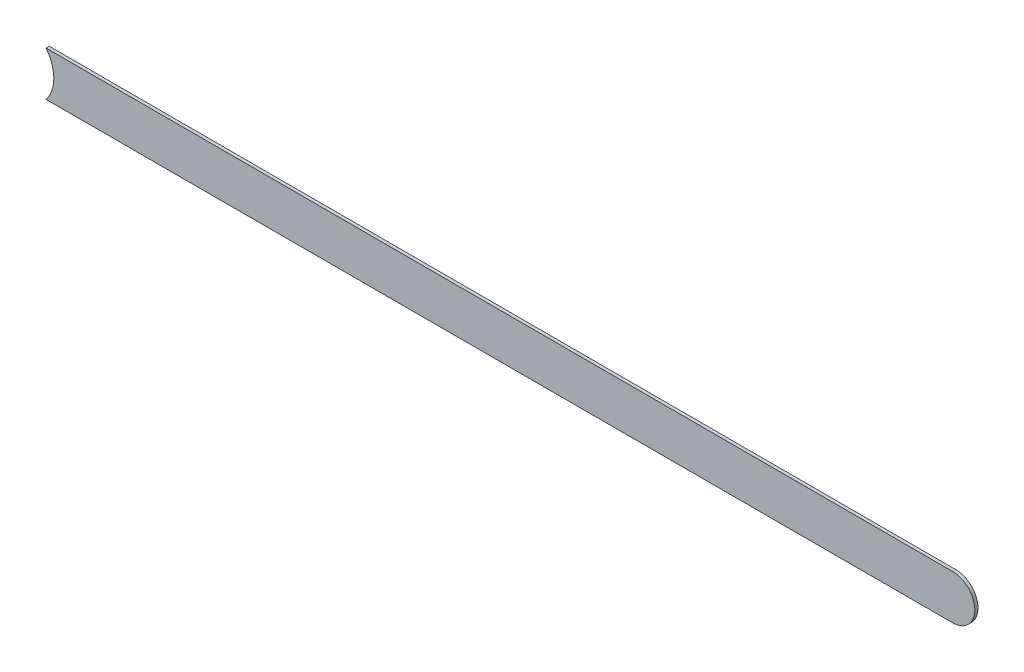
ISO-10303-21;
HEADER;
FILE_DESCRIPTION(('STEP AP214'),'2;1');
FILE_NAME('part.step','',(''),(''),'','','');
FILE_SCHEMA(('AUTOMOTIVE_DESIGN { 1 0 10303 214 1 1 1 1 }'));
ENDSEC;
DATA;
#1=APPLICATION_CONTEXT('core data for automotive mechanical design processes');
#2=APPLICATION_PROTOCOL_DEFINITION('international standard','automotive_design',2000,#1);
#3=PRODUCT_CONTEXT('',#1,'mechanical');
#4=PRODUCT('Part','Part','',(#3));
#5=PRODUCT_RELATED_PRODUCT_CATEGORY('part','',(#4));
#6=PRODUCT_DEFINITION_FORMATION('','',#4);
#7=PRODUCT_DEFINITION_CONTEXT('part definition',#1,'design');
#8=PRODUCT_DEFINITION('design','',#6,#7);
#9=PRODUCT_DEFINITION_SHAPE('','',#8);
#10=(LENGTH_UNIT() NAMED_UNIT(*) SI_UNIT(.MILLI.,.METRE.));
#11=(NAMED_UNIT(*) PLANE_ANGLE_UNIT() SI_UNIT($,.RADIAN.));
#12=(NAMED_UNIT(*) SI_UNIT($,.STERADIAN.) SOLID_ANGLE_UNIT());
#13=UNCERTAINTY_MEASURE_WITH_UNIT(LENGTH_MEASURE(1.E-05),#10,'distance_accuracy_value','');
#14=(GEOMETRIC_REPRESENTATION_CONTEXT(3) GLOBAL_UNCERTAINTY_ASSIGNED_CONTEXT((#13)) GLOBAL_UNIT_ASSIGNED_CONTEXT((#10,
#11,#12)) REPRESENTATION_CONTEXT('',''));
#15=CARTESIAN_POINT('',(0.,0.,0.));
#16=DIRECTION('',(0.,0.,1.));
#17=DIRECTION('',(1.,0.,0.));
#18=AXIS2_PLACEMENT_3D('',#15,#16,#17);
#19=CARTESIAN_POINT('',(74.7122528754201,85.2500073,0.));
#20=DIRECTION('',(0.,1.,0.));
#21=DIRECTION('',(1.,0.,0.));
#22=AXIS2_PLACEMENT_3D('',#19,#20,#21);
#23=PLANE('',#22);
#24=DIRECTION('',(1.,0.,0.));
#25=VECTOR('',#24,1.);
#26=CARTESIAN_POINT('',(74.4000036,85.2500073,0.03556));
#27=LINE('',#26,#25);
#28=CARTESIAN_POINT('',(74.7122528754201,85.2500073,0.03556));
#29=VERTEX_POINT('',#28);
#30=CARTESIAN_POINT('',(84.900008,85.2500073,0.03556));
#31=VERTEX_POINT('',#30);
#32=EDGE_CURVE('E11',#29,#31,#27,.T.);
#33=ORIENTED_EDGE('',*,*,#32,.F.);
#34=DIRECTION('',(0.,0.,1.));
#35=VECTOR('',#34,1.);
#36=CARTESIAN_POINT('',(74.7122528754201,85.2500073,0.));
#37=LINE('',#36,#35);
#38=CARTESIAN_POINT('',(74.7122528754201,85.2500073,0.));
#39=VERTEX_POINT('',#38);
#40=EDGE_CURVE('E24',#39,#29,#37,.T.);
#41=ORIENTED_EDGE('',*,*,#40,.F.);
#42=DIRECTION('',(1.,0.,0.));
#43=VECTOR('',#42,1.);
#44=CARTESIAN_POINT('',(74.4000036,85.2500073,0.));
#45=LINE('',#44,#43);
#46=CARTESIAN_POINT('',(84.900008,85.2500073,0.));
#47=VERTEX_POINT('',#46);
#48=EDGE_CURVE('E82',#39,#47,#45,.T.);
#49=ORIENTED_EDGE('',*,*,#48,.T.);
#50=DIRECTION('',(0.,0.,1.));
#51=VECTOR('',#50,1.);
#52=CARTESIAN_POINT('',(84.900008,85.2500073,0.));
#53=LINE('',#52,#51);
#54=EDGE_CURVE('E37',#47,#31,#53,.T.);
#55=ORIENTED_EDGE('',*,*,#54,.T.);
#56=EDGE_LOOP('',(#33,#41,#49,#55));
#57=FACE_BOUND('',#56,.T.);
#58=ADVANCED_FACE('F17',(#57),#23,.F.);
#59=CARTESIAN_POINT('',(84.900008,85.5000068,0.));
#60=DIRECTION('',(0.,0.,-1.));
#61=DIRECTION('',(0.,-1.,0.));
#62=AXIS2_PLACEMENT_3D('',#59,#60,#61);
#63=CYLINDRICAL_SURFACE('',#62,0.249999500000001);
#64=CARTESIAN_POINT('',(84.900008,85.5000068,0.03556));
#65=DIRECTION('',(0.,0.,1.));
#66=DIRECTION('',(0.,-1.,0.));
#67=AXIS2_PLACEMENT_3D('',#64,#65,#66);
#68=CIRCLE('',#67,0.249999500000001);
#69=CARTESIAN_POINT('',(84.900008,85.7500063,0.03556));
#70=VERTEX_POINT('',#69);
#71=EDGE_CURVE('E97',#31,#70,#68,.T.);
#72=ORIENTED_EDGE('',*,*,#71,.F.);
#73=ORIENTED_EDGE('',*,*,#54,.F.);
#74=CARTESIAN_POINT('',(84.900008,85.5000068,0.));
#75=DIRECTION('',(0.,0.,1.));
#76=DIRECTION('',(0.,-1.,0.));
#77=AXIS2_PLACEMENT_3D('',#74,#75,#76);
#78=CIRCLE('',#77,0.249999500000001);
#79=CARTESIAN_POINT('',(84.900008,85.7500063,0.));
#80=VERTEX_POINT('',#79);
#81=EDGE_CURVE('E94',#47,#80,#78,.T.);
#82=ORIENTED_EDGE('',*,*,#81,.T.);
#83=DIRECTION('',(0.,0.,1.));
#84=VECTOR('',#83,1.);
#85=CARTESIAN_POINT('',(84.900008,85.7500063,0.));
#86=LINE('',#85,#84);
#87=EDGE_CURVE('E92',#80,#70,#86,.T.);
#88=ORIENTED_EDGE('',*,*,#87,.T.);
#89=EDGE_LOOP('',(#72,#73,#82,#88));
#90=FACE_BOUND('',#89,.T.);
#91=ADVANCED_FACE('F103',(#90),#63,.T.);
#92=CARTESIAN_POINT('',(84.900008,85.7500063,0.));
#93=DIRECTION('',(0.,-1.,0.));
#94=DIRECTION('',(-1.,0.,0.));
#95=AXIS2_PLACEMENT_3D('',#92,#93,#94);
#96=PLANE('',#95);
#97=DIRECTION('',(-1.,0.,0.));
#98=VECTOR('',#97,1.);
#99=CARTESIAN_POINT('',(84.900008,85.7500063,0.03556));
#100=LINE('',#99,#98);
#101=CARTESIAN_POINT('',(74.7122528754201,85.7500063,0.03556));
#102=VERTEX_POINT('',#101);
#103=EDGE_CURVE('E89',#70,#102,#100,.T.);
#104=ORIENTED_EDGE('',*,*,#103,.F.);
#105=ORIENTED_EDGE('',*,*,#87,.F.);
#106=DIRECTION('',(-1.,0.,0.));
#107=VECTOR('',#106,1.);
#108=CARTESIAN_POINT('',(84.900008,85.7500063,0.));
#109=LINE('',#108,#107);
#110=CARTESIAN_POINT('',(74.7122528754201,85.7500063,0.));
#111=VERTEX_POINT('',#110);
#112=EDGE_CURVE('E87',#80,#111,#109,.T.);
#113=ORIENTED_EDGE('',*,*,#112,.T.);
#114=DIRECTION('',(0.,0.,1.));
#115=VECTOR('',#114,1.);
#116=CARTESIAN_POINT('',(74.7122528754201,85.7500063,0.));
#117=LINE('',#116,#115);
#118=EDGE_CURVE('E69',#111,#102,#117,.T.);
#119=ORIENTED_EDGE('',*,*,#118,.T.);
#120=EDGE_LOOP('',(#104,#105,#113,#119));
#121=FACE_BOUND('',#120,.T.);
#122=ADVANCED_FACE('F108',(#121),#96,.F.);
#123=CARTESIAN_POINT('',(74.4000036,85.5000068,0.));
#124=DIRECTION('',(0.,0.,-1.));
#125=DIRECTION('',(1.,0.,0.));
#126=AXIS2_PLACEMENT_3D('',#123,#124,#125);
#127=CYLINDRICAL_SURFACE('',#126,0.3999992);
#128=DIRECTION('',(0.,0.,1.));
#129=VECTOR('',#128,1.);
#130=CARTESIAN_POINT('',(74.8000028,85.5000068,0.));
#131=LINE('',#130,#129);
#132=CARTESIAN_POINT('',(74.8000028,85.5000068,0.));
#133=VERTEX_POINT('',#132);
#134=CARTESIAN_POINT('',(74.8000028,85.5000068,0.03556));
#135=VERTEX_POINT('',#134);
#136=EDGE_CURVE('E59',#133,#135,#131,.T.);
#137=ORIENTED_EDGE('',*,*,#136,.T.);
#138=CARTESIAN_POINT('',(74.4000036,85.5000068,0.03556));
#139=DIRECTION('',(0.,0.,1.));
#140=DIRECTION('',(1.,0.,0.));
#141=AXIS2_PLACEMENT_3D('',#138,#139,#140);
#142=CIRCLE('',#141,0.3999992);
#143=EDGE_CURVE('E70',#135,#102,#142,.T.);
#144=ORIENTED_EDGE('',*,*,#143,.T.);
#145=ORIENTED_EDGE('',*,*,#118,.F.);
#146=CARTESIAN_POINT('',(74.4000036,85.5000068,0.));
#147=DIRECTION('',(0.,0.,1.));
#148=DIRECTION('',(1.,0.,0.));
#149=AXIS2_PLACEMENT_3D('',#146,#147,#148);
#150=CIRCLE('',#149,0.3999992);
#151=EDGE_CURVE('E73',#133,#111,#150,.T.);
#152=ORIENTED_EDGE('',*,*,#151,.F.);
#153=EDGE_LOOP('',(#137,#144,#145,#152));
#154=FACE_BOUND('',#153,.T.);
#155=ADVANCED_FACE('F74',(#154),#127,.F.);
#156=CARTESIAN_POINT('',(74.4000036,85.5000068,0.));
#157=DIRECTION('',(0.,0.,-1.));
#158=DIRECTION('',(1.,0.,0.));
#159=AXIS2_PLACEMENT_3D('',#156,#157,#158);
#160=CYLINDRICAL_SURFACE('',#159,0.3999992);
#161=ORIENTED_EDGE('',*,*,#40,.T.);
#162=CARTESIAN_POINT('',(74.4000036,85.5000068,0.03556));
#163=DIRECTION('',(0.,0.,1.));
#164=DIRECTION('',(1.,0.,0.));
#165=AXIS2_PLACEMENT_3D('',#162,#163,#164);
#166=CIRCLE('',#165,0.3999992);
#167=EDGE_CURVE('E65',#29,#135,#166,.T.);
#168=ORIENTED_EDGE('',*,*,#167,.T.);
#169=ORIENTED_EDGE('',*,*,#136,.F.);
#170=EDGE_CURVE('E63',#39,#133,#150,.T.);
#171=ORIENTED_EDGE('',*,*,#170,.F.);
#172=EDGE_LOOP('',(#161,#168,#169,#171));
#173=FACE_BOUND('',#172,.T.);
#174=ADVANCED_FACE('F61',(#173),#160,.F.);
#175=CARTESIAN_POINT('',(74.4000036,85.2500073,0.));
#176=DIRECTION('',(0.,0.,-1.));
#177=DIRECTION('',(-1.,0.,0.));
#178=AXIS2_PLACEMENT_3D('',#175,#176,#177);
#179=PLANE('',#178);
#180=ORIENTED_EDGE('',*,*,#48,.F.);
#181=ORIENTED_EDGE('',*,*,#170,.T.);
#182=ORIENTED_EDGE('',*,*,#151,.T.);
#183=ORIENTED_EDGE('',*,*,#112,.F.);
#184=ORIENTED_EDGE('',*,*,#81,.F.);
#185=EDGE_LOOP('',(#180,#181,#182,#183,#184));
#186=FACE_BOUND('',#185,.T.);
#187=ADVANCED_FACE('F80',(#186),#179,.T.);
#188=CARTESIAN_POINT('',(74.4000036,85.2500073,0.03556));
#189=DIRECTION('',(0.,0.,-1.));
#190=DIRECTION('',(-1.,0.,0.));
#191=AXIS2_PLACEMENT_3D('',#188,#189,#190);
#192=PLANE('',#191);
#193=ORIENTED_EDGE('',*,*,#167,.F.);
#194=ORIENTED_EDGE('',*,*,#32,.T.);
#195=ORIENTED_EDGE('',*,*,#71,.T.);
#196=ORIENTED_EDGE('',*,*,#103,.T.);
#197=ORIENTED_EDGE('',*,*,#143,.F.);
#198=EDGE_LOOP('',(#193,#194,#195,#196,#197));
#199=FACE_BOUND('',#198,.T.);
#200=ADVANCED_FACE('F106',(#199),#192,.F.);
#201=CLOSED_SHELL('',(#58,#91,#122,#155,#174,#187,#200));
#202=MANIFOLD_SOLID_BREP('B1',#201);
#203=ADVANCED_BREP_SHAPE_REPRESENTATION('',(#18,#202),#14);
#204=SHAPE_DEFINITION_REPRESENTATION(#9,#203);
ENDSEC;
END-ISO-10303-21;
